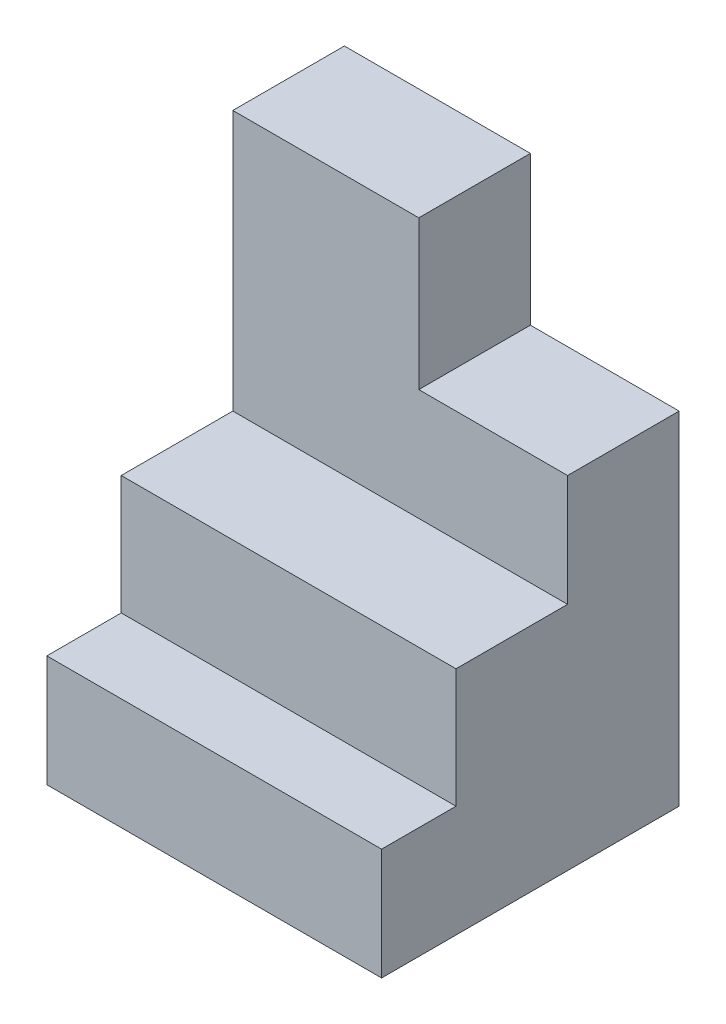
ISO-10303-21;
HEADER;
FILE_DESCRIPTION(('STEP AP214'),'2;1');
FILE_NAME('part.step','',(''),(''),'','','');
FILE_SCHEMA(('AUTOMOTIVE_DESIGN { 1 0 10303 214 1 1 1 1 }'));
ENDSEC;
DATA;
#1=APPLICATION_CONTEXT('core data for automotive mechanical design processes');
#2=APPLICATION_PROTOCOL_DEFINITION('international standard','automotive_design',2000,#1);
#3=PRODUCT_CONTEXT('',#1,'mechanical');
#4=PRODUCT('Part','Part','',(#3));
#5=PRODUCT_RELATED_PRODUCT_CATEGORY('part','',(#4));
#6=PRODUCT_DEFINITION_FORMATION('','',#4);
#7=PRODUCT_DEFINITION_CONTEXT('part definition',#1,'design');
#8=PRODUCT_DEFINITION('design','',#6,#7);
#9=PRODUCT_DEFINITION_SHAPE('','',#8);
#10=(LENGTH_UNIT() NAMED_UNIT(*) SI_UNIT(.MILLI.,.METRE.));
#11=(NAMED_UNIT(*) PLANE_ANGLE_UNIT() SI_UNIT($,.RADIAN.));
#12=(NAMED_UNIT(*) SI_UNIT($,.STERADIAN.) SOLID_ANGLE_UNIT());
#13=UNCERTAINTY_MEASURE_WITH_UNIT(LENGTH_MEASURE(1.E-05),#10,'distance_accuracy_value','');
#14=(GEOMETRIC_REPRESENTATION_CONTEXT(3) GLOBAL_UNCERTAINTY_ASSIGNED_CONTEXT((#13)) GLOBAL_UNIT_ASSIGNED_CONTEXT((#10,
#11,#12)) REPRESENTATION_CONTEXT('',''));
#15=CARTESIAN_POINT('',(0.,0.,0.));
#16=DIRECTION('',(0.,0.,1.));
#17=DIRECTION('',(1.,0.,0.));
#18=AXIS2_PLACEMENT_3D('',#15,#16,#17);
#19=CARTESIAN_POINT('',(0.,0.,0.75));
#20=DIRECTION('',(0.,0.,-1.));
#21=DIRECTION('',(-1.,0.,0.));
#22=AXIS2_PLACEMENT_3D('',#19,#20,#21);
#23=PLANE('',#22);
#24=DIRECTION('',(-1.,0.,0.));
#25=VECTOR('',#24,1.);
#26=CARTESIAN_POINT('',(-1.125,-0.1,0.75));
#27=LINE('',#26,#25);
#28=CARTESIAN_POINT('',(1.125,-0.1,0.75));
#29=VERTEX_POINT('',#28);
#30=CARTESIAN_POINT('',(-1.125,-0.1,0.75));
#31=VERTEX_POINT('',#30);
#32=EDGE_CURVE('E129',#29,#31,#27,.T.);
#33=ORIENTED_EDGE('',*,*,#32,.F.);
#34=DIRECTION('',(0.,1.,0.));
#35=VECTOR('',#34,1.);
#36=CARTESIAN_POINT('',(1.125,-1.65,0.75));
#37=LINE('',#36,#35);
#38=CARTESIAN_POINT('',(1.125,0.65,0.75));
#39=VERTEX_POINT('',#38);
#40=EDGE_CURVE('E142',#29,#39,#37,.T.);
#41=ORIENTED_EDGE('',*,*,#40,.T.);
#42=DIRECTION('',(-1.,0.,0.));
#43=VECTOR('',#42,1.);
#44=CARTESIAN_POINT('',(1.125,0.65,0.75));
#45=LINE('',#44,#43);
#46=CARTESIAN_POINT('',(0.125,0.65,0.75));
#47=VERTEX_POINT('',#46);
#48=EDGE_CURVE('E185',#39,#47,#45,.T.);
#49=ORIENTED_EDGE('',*,*,#48,.T.);
#50=DIRECTION('',(0.,1.,0.));
#51=VECTOR('',#50,1.);
#52=CARTESIAN_POINT('',(0.125,1.65,0.75));
#53=LINE('',#52,#51);
#54=CARTESIAN_POINT('',(0.125,1.65,0.75));
#55=VERTEX_POINT('',#54);
#56=EDGE_CURVE('E184',#47,#55,#53,.T.);
#57=ORIENTED_EDGE('',*,*,#56,.T.);
#58=DIRECTION('',(-1.,0.,0.));
#59=VECTOR('',#58,1.);
#60=CARTESIAN_POINT('',(-1.125,1.65,0.75));
#61=LINE('',#60,#59);
#62=CARTESIAN_POINT('',(-1.125,1.65,0.75));
#63=VERTEX_POINT('',#62);
#64=EDGE_CURVE('E171',#55,#63,#61,.T.);
#65=ORIENTED_EDGE('',*,*,#64,.T.);
#66=DIRECTION('',(0.,-1.,0.));
#67=VECTOR('',#66,1.);
#68=CARTESIAN_POINT('',(-1.125,-1.65,0.75));
#69=LINE('',#68,#67);
#70=EDGE_CURVE('E151',#63,#31,#69,.T.);
#71=ORIENTED_EDGE('',*,*,#70,.T.);
#72=EDGE_LOOP('',(#33,#41,#49,#57,#65,#71));
#73=FACE_BOUND('',#72,.T.);
#74=ADVANCED_FACE('F33',(#73),#23,.F.);
#75=CARTESIAN_POINT('',(-1.125,-1.65,0.75));
#76=DIRECTION('',(1.,0.,0.));
#77=DIRECTION('',(0.,0.,-1.));
#78=AXIS2_PLACEMENT_3D('',#75,#76,#77);
#79=PLANE('',#78);
#80=DIRECTION('',(0.,-1.,0.));
#81=VECTOR('',#80,1.);
#82=CARTESIAN_POINT('',(-1.125,-1.65,2.));
#83=LINE('',#82,#81);
#84=CARTESIAN_POINT('',(-1.125,-0.9,2.));
#85=VERTEX_POINT('',#84);
#86=CARTESIAN_POINT('',(-1.125,-1.65,2.));
#87=VERTEX_POINT('',#86);
#88=EDGE_CURVE('E141',#85,#87,#83,.T.);
#89=ORIENTED_EDGE('',*,*,#88,.F.);
#90=DIRECTION('',(0.,0.,1.));
#91=VECTOR('',#90,1.);
#92=CARTESIAN_POINT('',(-1.125,-0.9,2.));
#93=LINE('',#92,#91);
#94=CARTESIAN_POINT('',(-1.125,-0.9,1.5));
#95=VERTEX_POINT('',#94);
#96=EDGE_CURVE('E51',#95,#85,#93,.T.);
#97=ORIENTED_EDGE('',*,*,#96,.F.);
#98=DIRECTION('',(0.,-1.,0.));
#99=VECTOR('',#98,1.);
#100=CARTESIAN_POINT('',(-1.125,-0.1,1.5));
#101=LINE('',#100,#99);
#102=CARTESIAN_POINT('',(-1.125,-0.1,1.5));
#103=VERTEX_POINT('',#102);
#104=EDGE_CURVE('E116',#103,#95,#101,.T.);
#105=ORIENTED_EDGE('',*,*,#104,.F.);
#106=DIRECTION('',(0.,0.,-1.));
#107=VECTOR('',#106,1.);
#108=CARTESIAN_POINT('',(-1.125,-0.1,2.));
#109=LINE('',#108,#107);
#110=EDGE_CURVE('E125',#103,#31,#109,.T.);
#111=ORIENTED_EDGE('',*,*,#110,.T.);
#112=ORIENTED_EDGE('',*,*,#70,.F.);
#113=DIRECTION('',(0.,0.,-1.));
#114=VECTOR('',#113,1.);
#115=CARTESIAN_POINT('',(-1.125,1.65,0.75));
#116=LINE('',#115,#114);
#117=CARTESIAN_POINT('',(-1.125,1.65,0.));
#118=VERTEX_POINT('',#117);
#119=EDGE_CURVE('E168',#63,#118,#116,.T.);
#120=ORIENTED_EDGE('',*,*,#119,.T.);
#121=DIRECTION('',(0.,-1.,0.));
#122=VECTOR('',#121,1.);
#123=CARTESIAN_POINT('',(-1.125,-1.65,0.));
#124=LINE('',#123,#122);
#125=CARTESIAN_POINT('',(-1.125,-1.65,0.));
#126=VERTEX_POINT('',#125);
#127=EDGE_CURVE('E131',#118,#126,#124,.T.);
#128=ORIENTED_EDGE('',*,*,#127,.T.);
#129=DIRECTION('',(0.,0.,-1.));
#130=VECTOR('',#129,1.);
#131=CARTESIAN_POINT('',(-1.125,-1.65,0.75));
#132=LINE('',#131,#130);
#133=EDGE_CURVE('E43',#87,#126,#132,.T.);
#134=ORIENTED_EDGE('',*,*,#133,.F.);
#135=EDGE_LOOP('',(#89,#97,#105,#111,#112,#120,#128,#134));
#136=FACE_BOUND('',#135,.T.);
#137=ADVANCED_FACE('F35',(#136),#79,.F.);
#138=CARTESIAN_POINT('',(-1.125,-1.65,0.75));
#139=DIRECTION('',(0.,1.,0.));
#140=DIRECTION('',(0.,0.,1.));
#141=AXIS2_PLACEMENT_3D('',#138,#139,#140);
#142=PLANE('',#141);
#143=DIRECTION('',(1.,0.,0.));
#144=VECTOR('',#143,1.);
#145=CARTESIAN_POINT('',(-1.125,-1.65,0.));
#146=LINE('',#145,#144);
#147=CARTESIAN_POINT('',(1.125,-1.65,0.));
#148=VERTEX_POINT('',#147);
#149=EDGE_CURVE('E179',#126,#148,#146,.T.);
#150=ORIENTED_EDGE('',*,*,#149,.T.);
#151=DIRECTION('',(0.,0.,-1.));
#152=VECTOR('',#151,1.);
#153=CARTESIAN_POINT('',(1.125,-1.65,0.75));
#154=LINE('',#153,#152);
#155=CARTESIAN_POINT('',(1.125,-1.65,2.));
#156=VERTEX_POINT('',#155);
#157=EDGE_CURVE('E156',#156,#148,#154,.T.);
#158=ORIENTED_EDGE('',*,*,#157,.F.);
#159=DIRECTION('',(1.,0.,0.));
#160=VECTOR('',#159,1.);
#161=CARTESIAN_POINT('',(-1.125,-1.65,2.));
#162=LINE('',#161,#160);
#163=EDGE_CURVE('E133',#87,#156,#162,.T.);
#164=ORIENTED_EDGE('',*,*,#163,.F.);
#165=ORIENTED_EDGE('',*,*,#133,.T.);
#166=EDGE_LOOP('',(#150,#158,#164,#165));
#167=FACE_BOUND('',#166,.T.);
#168=ADVANCED_FACE('F213',(#167),#142,.F.);
#169=CARTESIAN_POINT('',(1.125,-1.65,0.75));
#170=DIRECTION('',(-1.,0.,0.));
#171=DIRECTION('',(0.,-1.,0.));
#172=AXIS2_PLACEMENT_3D('',#169,#170,#171);
#173=PLANE('',#172);
#174=DIRECTION('',(0.,-1.,0.));
#175=VECTOR('',#174,1.);
#176=CARTESIAN_POINT('',(1.125,-1.65,1.5));
#177=LINE('',#176,#175);
#178=CARTESIAN_POINT('',(1.125,-0.1,1.5));
#179=VERTEX_POINT('',#178);
#180=CARTESIAN_POINT('',(1.125,-0.9,1.5));
#181=VERTEX_POINT('',#180);
#182=EDGE_CURVE('E118',#179,#181,#177,.T.);
#183=ORIENTED_EDGE('',*,*,#182,.T.);
#184=DIRECTION('',(0.,0.,1.));
#185=VECTOR('',#184,1.);
#186=CARTESIAN_POINT('',(1.125,-0.9,0.75));
#187=LINE('',#186,#185);
#188=CARTESIAN_POINT('',(1.125,-0.9,2.));
#189=VERTEX_POINT('',#188);
#190=EDGE_CURVE('E219',#181,#189,#187,.T.);
#191=ORIENTED_EDGE('',*,*,#190,.T.);
#192=DIRECTION('',(0.,1.,0.));
#193=VECTOR('',#192,1.);
#194=CARTESIAN_POINT('',(1.125,-1.65,2.));
#195=LINE('',#194,#193);
#196=EDGE_CURVE('E130',#156,#189,#195,.T.);
#197=ORIENTED_EDGE('',*,*,#196,.F.);
#198=ORIENTED_EDGE('',*,*,#157,.T.);
#199=DIRECTION('',(0.,1.,0.));
#200=VECTOR('',#199,1.);
#201=CARTESIAN_POINT('',(1.125,-1.65,0.));
#202=LINE('',#201,#200);
#203=CARTESIAN_POINT('',(1.125,0.65,0.));
#204=VERTEX_POINT('',#203);
#205=EDGE_CURVE('E177',#148,#204,#202,.T.);
#206=ORIENTED_EDGE('',*,*,#205,.T.);
#207=DIRECTION('',(0.,0.,-1.));
#208=VECTOR('',#207,1.);
#209=CARTESIAN_POINT('',(1.125,0.65,0.75));
#210=LINE('',#209,#208);
#211=EDGE_CURVE('E159',#39,#204,#210,.T.);
#212=ORIENTED_EDGE('',*,*,#211,.F.);
#213=ORIENTED_EDGE('',*,*,#40,.F.);
#214=DIRECTION('',(0.,0.,-1.));
#215=VECTOR('',#214,1.);
#216=CARTESIAN_POINT('',(1.125,-0.1,2.));
#217=LINE('',#216,#215);
#218=EDGE_CURVE('E37',#179,#29,#217,.T.);
#219=ORIENTED_EDGE('',*,*,#218,.F.);
#220=EDGE_LOOP('',(#183,#191,#197,#198,#206,#212,#213,#219));
#221=FACE_BOUND('',#220,.T.);
#222=ADVANCED_FACE('F192',(#221),#173,.F.);
#223=CARTESIAN_POINT('',(1.125,0.65,0.75));
#224=DIRECTION('',(0.,-1.,0.));
#225=DIRECTION('',(1.,0.,0.));
#226=AXIS2_PLACEMENT_3D('',#223,#224,#225);
#227=PLANE('',#226);
#228=DIRECTION('',(-1.,0.,0.));
#229=VECTOR('',#228,1.);
#230=CARTESIAN_POINT('',(1.125,0.65,0.));
#231=LINE('',#230,#229);
#232=CARTESIAN_POINT('',(0.125,0.65,0.));
#233=VERTEX_POINT('',#232);
#234=EDGE_CURVE('E175',#204,#233,#231,.T.);
#235=ORIENTED_EDGE('',*,*,#234,.T.);
#236=DIRECTION('',(0.,0.,-1.));
#237=VECTOR('',#236,1.);
#238=CARTESIAN_POINT('',(0.125,0.65,0.75));
#239=LINE('',#238,#237);
#240=EDGE_CURVE('E162',#47,#233,#239,.T.);
#241=ORIENTED_EDGE('',*,*,#240,.F.);
#242=ORIENTED_EDGE('',*,*,#48,.F.);
#243=ORIENTED_EDGE('',*,*,#211,.T.);
#244=EDGE_LOOP('',(#235,#241,#242,#243));
#245=FACE_BOUND('',#244,.T.);
#246=ADVANCED_FACE('F196',(#245),#227,.F.);
#247=CARTESIAN_POINT('',(0.125,1.65,0.75));
#248=DIRECTION('',(-1.,0.,0.));
#249=DIRECTION('',(0.,-1.,0.));
#250=AXIS2_PLACEMENT_3D('',#247,#248,#249);
#251=PLANE('',#250);
#252=DIRECTION('',(0.,1.,0.));
#253=VECTOR('',#252,1.);
#254=CARTESIAN_POINT('',(0.125,1.65,0.));
#255=LINE('',#254,#253);
#256=CARTESIAN_POINT('',(0.125,1.65,0.));
#257=VERTEX_POINT('',#256);
#258=EDGE_CURVE('E173',#233,#257,#255,.T.);
#259=ORIENTED_EDGE('',*,*,#258,.T.);
#260=DIRECTION('',(0.,0.,-1.));
#261=VECTOR('',#260,1.);
#262=CARTESIAN_POINT('',(0.125,1.65,0.75));
#263=LINE('',#262,#261);
#264=EDGE_CURVE('E165',#55,#257,#263,.T.);
#265=ORIENTED_EDGE('',*,*,#264,.F.);
#266=ORIENTED_EDGE('',*,*,#56,.F.);
#267=ORIENTED_EDGE('',*,*,#240,.T.);
#268=EDGE_LOOP('',(#259,#265,#266,#267));
#269=FACE_BOUND('',#268,.T.);
#270=ADVANCED_FACE('F201',(#269),#251,.F.);
#271=CARTESIAN_POINT('',(-1.125,1.65,0.75));
#272=DIRECTION('',(0.,-1.,0.));
#273=DIRECTION('',(1.,0.,0.));
#274=AXIS2_PLACEMENT_3D('',#271,#272,#273);
#275=PLANE('',#274);
#276=DIRECTION('',(-1.,0.,0.));
#277=VECTOR('',#276,1.);
#278=CARTESIAN_POINT('',(-1.125,1.65,0.));
#279=LINE('',#278,#277);
#280=EDGE_CURVE('E153',#257,#118,#279,.T.);
#281=ORIENTED_EDGE('',*,*,#280,.T.);
#282=ORIENTED_EDGE('',*,*,#119,.F.);
#283=ORIENTED_EDGE('',*,*,#64,.F.);
#284=ORIENTED_EDGE('',*,*,#264,.T.);
#285=EDGE_LOOP('',(#281,#282,#283,#284));
#286=FACE_BOUND('',#285,.T.);
#287=ADVANCED_FACE('F205',(#286),#275,.F.);
#288=CARTESIAN_POINT('',(0.,0.,0.));
#289=DIRECTION('',(0.,0.,-1.));
#290=DIRECTION('',(-1.,0.,0.));
#291=AXIS2_PLACEMENT_3D('',#288,#289,#290);
#292=PLANE('',#291);
#293=ORIENTED_EDGE('',*,*,#127,.F.);
#294=ORIENTED_EDGE('',*,*,#280,.F.);
#295=ORIENTED_EDGE('',*,*,#258,.F.);
#296=ORIENTED_EDGE('',*,*,#234,.F.);
#297=ORIENTED_EDGE('',*,*,#205,.F.);
#298=ORIENTED_EDGE('',*,*,#149,.F.);
#299=EDGE_LOOP('',(#293,#294,#295,#296,#297,#298));
#300=FACE_BOUND('',#299,.T.);
#301=ADVANCED_FACE('F210',(#300),#292,.T.);
#302=CARTESIAN_POINT('',(-1.125,-0.1,2.));
#303=DIRECTION('',(0.,-1.,0.));
#304=DIRECTION('',(0.,0.,-1.));
#305=AXIS2_PLACEMENT_3D('',#302,#303,#304);
#306=PLANE('',#305);
#307=ORIENTED_EDGE('',*,*,#110,.F.);
#308=DIRECTION('',(-1.,0.,0.));
#309=VECTOR('',#308,1.);
#310=CARTESIAN_POINT('',(1.12505,-0.1,1.5));
#311=LINE('',#310,#309);
#312=EDGE_CURVE('E112',#179,#103,#311,.T.);
#313=ORIENTED_EDGE('',*,*,#312,.F.);
#314=ORIENTED_EDGE('',*,*,#218,.T.);
#315=ORIENTED_EDGE('',*,*,#32,.T.);
#316=EDGE_LOOP('',(#307,#313,#314,#315));
#317=FACE_BOUND('',#316,.T.);
#318=ADVANCED_FACE('F128',(#317),#306,.F.);
#319=CARTESIAN_POINT('',(0.,0.,2.));
#320=DIRECTION('',(0.,0.,-1.));
#321=DIRECTION('',(-1.,0.,0.));
#322=AXIS2_PLACEMENT_3D('',#319,#320,#321);
#323=PLANE('',#322);
#324=ORIENTED_EDGE('',*,*,#196,.T.);
#325=DIRECTION('',(-1.,0.,0.));
#326=VECTOR('',#325,1.);
#327=CARTESIAN_POINT('',(0.,-0.9,2.));
#328=LINE('',#327,#326);
#329=EDGE_CURVE('E11',#189,#85,#328,.T.);
#330=ORIENTED_EDGE('',*,*,#329,.T.);
#331=ORIENTED_EDGE('',*,*,#88,.T.);
#332=ORIENTED_EDGE('',*,*,#163,.T.);
#333=EDGE_LOOP('',(#324,#330,#331,#332));
#334=FACE_BOUND('',#333,.T.);
#335=ADVANCED_FACE('F225',(#334),#323,.F.);
#336=CARTESIAN_POINT('',(1.12505,-0.1,1.5));
#337=DIRECTION('',(0.,0.,-1.));
#338=DIRECTION('',(-1.,0.,0.));
#339=AXIS2_PLACEMENT_3D('',#336,#337,#338);
#340=PLANE('',#339);
#341=ORIENTED_EDGE('',*,*,#312,.T.);
#342=ORIENTED_EDGE('',*,*,#104,.T.);
#343=DIRECTION('',(-1.,0.,0.));
#344=VECTOR('',#343,1.);
#345=CARTESIAN_POINT('',(1.12505,-0.9,1.5));
#346=LINE('',#345,#344);
#347=EDGE_CURVE('E120',#181,#95,#346,.T.);
#348=ORIENTED_EDGE('',*,*,#347,.F.);
#349=ORIENTED_EDGE('',*,*,#182,.F.);
#350=EDGE_LOOP('',(#341,#342,#348,#349));
#351=FACE_BOUND('',#350,.T.);
#352=ADVANCED_FACE('F114',(#351),#340,.F.);
#353=CARTESIAN_POINT('',(1.12505,-0.9,2.));
#354=DIRECTION('',(0.,-1.,0.));
#355=DIRECTION('',(0.,0.,-1.));
#356=AXIS2_PLACEMENT_3D('',#353,#354,#355);
#357=PLANE('',#356);
#358=ORIENTED_EDGE('',*,*,#347,.T.);
#359=ORIENTED_EDGE('',*,*,#96,.T.);
#360=ORIENTED_EDGE('',*,*,#329,.F.);
#361=ORIENTED_EDGE('',*,*,#190,.F.);
#362=EDGE_LOOP('',(#358,#359,#360,#361));
#363=FACE_BOUND('',#362,.T.);
#364=ADVANCED_FACE('F223',(#363),#357,.F.);
#365=CLOSED_SHELL('',(#74,#137,#168,#222,#246,#270,#287,#301,#318,#335,#352,#364));
#366=MANIFOLD_SOLID_BREP('B2',#365);
#367=ADVANCED_BREP_SHAPE_REPRESENTATION('',(#18,#366),#14);
#368=SHAPE_DEFINITION_REPRESENTATION(#9,#367);
ENDSEC;
END-ISO-10303-21;
